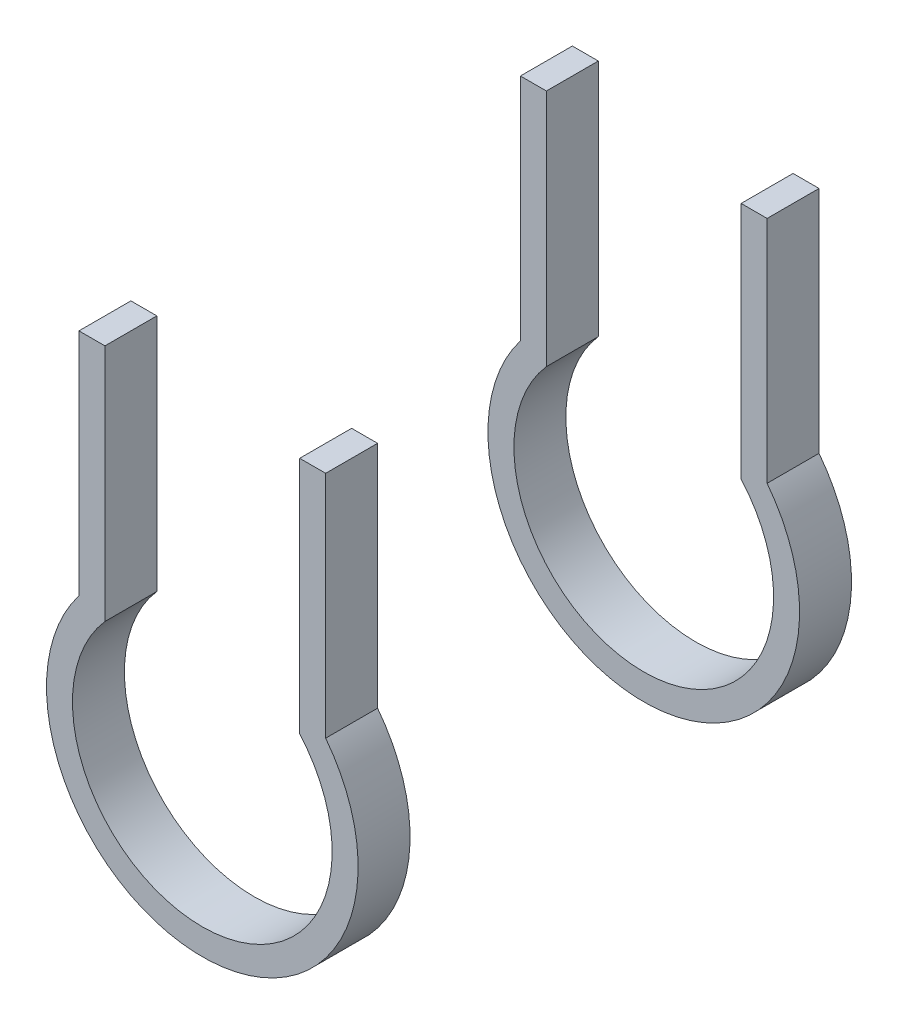
ISO-10303-21;
HEADER;
FILE_DESCRIPTION(('STEP AP214'),'2;1');
FILE_NAME('part.step','',(''),(''),'','','');
FILE_SCHEMA(('AUTOMOTIVE_DESIGN { 1 0 10303 214 1 1 1 1 }'));
ENDSEC;
DATA;
#1=APPLICATION_CONTEXT('core data for automotive mechanical design processes');
#2=APPLICATION_PROTOCOL_DEFINITION('international standard','automotive_design',2000,#1);
#3=PRODUCT_CONTEXT('',#1,'mechanical');
#4=PRODUCT('Part','Part','',(#3));
#5=PRODUCT_RELATED_PRODUCT_CATEGORY('part','',(#4));
#6=PRODUCT_DEFINITION_FORMATION('','',#4);
#7=PRODUCT_DEFINITION_CONTEXT('part definition',#1,'design');
#8=PRODUCT_DEFINITION('design','',#6,#7);
#9=PRODUCT_DEFINITION_SHAPE('','',#8);
#10=(LENGTH_UNIT() NAMED_UNIT(*) SI_UNIT(.MILLI.,.METRE.));
#11=(NAMED_UNIT(*) PLANE_ANGLE_UNIT() SI_UNIT($,.RADIAN.));
#12=(NAMED_UNIT(*) SI_UNIT($,.STERADIAN.) SOLID_ANGLE_UNIT());
#13=UNCERTAINTY_MEASURE_WITH_UNIT(LENGTH_MEASURE(1.E-05),#10,'distance_accuracy_value','');
#14=(GEOMETRIC_REPRESENTATION_CONTEXT(3) GLOBAL_UNCERTAINTY_ASSIGNED_CONTEXT((#13)) GLOBAL_UNIT_ASSIGNED_CONTEXT((#10,
#11,#12)) REPRESENTATION_CONTEXT('',''));
#15=CARTESIAN_POINT('',(0.,0.,0.));
#16=DIRECTION('',(0.,0.,1.));
#17=DIRECTION('',(1.,0.,0.));
#18=AXIS2_PLACEMENT_3D('',#15,#16,#17);
#19=CARTESIAN_POINT('',(-19.,50.,76.));
#20=DIRECTION('',(0.,-1.,0.));
#21=DIRECTION('',(0.,0.,-1.));
#22=AXIS2_PLACEMENT_3D('',#19,#20,#21);
#23=PLANE('',#22);
#24=DIRECTION('',(1.,0.,0.));
#25=VECTOR('',#24,1.);
#26=CARTESIAN_POINT('',(-19.,50.,68.));
#27=LINE('',#26,#25);
#28=CARTESIAN_POINT('',(-19.,50.,68.));
#29=VERTEX_POINT('',#28);
#30=CARTESIAN_POINT('',(-15.,50.,68.));
#31=VERTEX_POINT('',#30);
#32=EDGE_CURVE('E84',#29,#31,#27,.T.);
#33=ORIENTED_EDGE('',*,*,#32,.F.);
#34=DIRECTION('',(0.,0.,-1.));
#35=VECTOR('',#34,1.);
#36=CARTESIAN_POINT('',(-19.,50.,76.));
#37=LINE('',#36,#35);
#38=CARTESIAN_POINT('',(-19.,50.,76.));
#39=VERTEX_POINT('',#38);
#40=EDGE_CURVE('E113',#39,#29,#37,.T.);
#41=ORIENTED_EDGE('',*,*,#40,.F.);
#42=DIRECTION('',(-1.,0.,0.));
#43=VECTOR('',#42,1.);
#44=CARTESIAN_POINT('',(-19.,50.,76.));
#45=LINE('',#44,#43);
#46=CARTESIAN_POINT('',(-15.,50.,76.));
#47=VERTEX_POINT('',#46);
#48=EDGE_CURVE('E118',#47,#39,#45,.T.);
#49=ORIENTED_EDGE('',*,*,#48,.F.);
#50=DIRECTION('',(0.,0.,-1.));
#51=VECTOR('',#50,1.);
#52=CARTESIAN_POINT('',(-15.,50.,76.));
#53=LINE('',#52,#51);
#54=EDGE_CURVE('E45',#47,#31,#53,.T.);
#55=ORIENTED_EDGE('',*,*,#54,.T.);
#56=EDGE_LOOP('',(#33,#41,#49,#55));
#57=FACE_BOUND('',#56,.T.);
#58=ADVANCED_FACE('F42',(#57),#23,.F.);
#59=CARTESIAN_POINT('',(-19.,50.,76.));
#60=DIRECTION('',(1.,0.,0.));
#61=DIRECTION('',(0.,1.,0.));
#62=AXIS2_PLACEMENT_3D('',#59,#60,#61);
#63=PLANE('',#62);
#64=DIRECTION('',(0.,1.,0.));
#65=VECTOR('',#64,1.);
#66=CARTESIAN_POINT('',(-19.,50.,68.));
#67=LINE('',#66,#65);
#68=CARTESIAN_POINT('',(-19.,14.6628782986152,68.));
#69=VERTEX_POINT('',#68);
#70=EDGE_CURVE('E12',#69,#29,#67,.T.);
#71=ORIENTED_EDGE('',*,*,#70,.F.);
#72=DIRECTION('',(0.,0.,-1.));
#73=VECTOR('',#72,1.);
#74=CARTESIAN_POINT('',(-19.,14.6628782986152,76.));
#75=LINE('',#74,#73);
#76=CARTESIAN_POINT('',(-19.,14.6628782986152,76.));
#77=VERTEX_POINT('',#76);
#78=EDGE_CURVE('E115',#77,#69,#75,.T.);
#79=ORIENTED_EDGE('',*,*,#78,.F.);
#80=DIRECTION('',(0.,-1.,0.));
#81=VECTOR('',#80,1.);
#82=CARTESIAN_POINT('',(-19.,50.,76.));
#83=LINE('',#82,#81);
#84=EDGE_CURVE('E107',#39,#77,#83,.T.);
#85=ORIENTED_EDGE('',*,*,#84,.F.);
#86=ORIENTED_EDGE('',*,*,#40,.T.);
#87=EDGE_LOOP('',(#71,#79,#85,#86));
#88=FACE_BOUND('',#87,.T.);
#89=ADVANCED_FACE('F111',(#88),#63,.F.);
#90=CARTESIAN_POINT('',(0.,0.,76.));
#91=DIRECTION('',(0.,0.,-1.));
#92=DIRECTION('',(-1.,0.,0.));
#93=AXIS2_PLACEMENT_3D('',#90,#91,#92);
#94=CYLINDRICAL_SURFACE('',#93,24.);
#95=CARTESIAN_POINT('',(0.,0.,68.));
#96=DIRECTION('',(0.,0.,-1.));
#97=DIRECTION('',(-1.,0.,0.));
#98=AXIS2_PLACEMENT_3D('',#95,#96,#97);
#99=CIRCLE('',#98,24.);
#100=CARTESIAN_POINT('',(19.,14.6628782986152,68.));
#101=VERTEX_POINT('',#100);
#102=EDGE_CURVE('E51',#101,#69,#99,.T.);
#103=ORIENTED_EDGE('',*,*,#102,.F.);
#104=DIRECTION('',(0.,0.,-1.));
#105=VECTOR('',#104,1.);
#106=CARTESIAN_POINT('',(19.,14.6628782986152,76.));
#107=LINE('',#106,#105);
#108=CARTESIAN_POINT('',(19.,14.6628782986152,76.));
#109=VERTEX_POINT('',#108);
#110=EDGE_CURVE('E130',#109,#101,#107,.T.);
#111=ORIENTED_EDGE('',*,*,#110,.F.);
#112=CARTESIAN_POINT('',(0.,0.,76.));
#113=DIRECTION('',(0.,0.,1.));
#114=DIRECTION('',(1.,0.,0.));
#115=AXIS2_PLACEMENT_3D('',#112,#113,#114);
#116=CIRCLE('',#115,24.);
#117=EDGE_CURVE('E117',#77,#109,#116,.T.);
#118=ORIENTED_EDGE('',*,*,#117,.F.);
#119=ORIENTED_EDGE('',*,*,#78,.T.);
#120=EDGE_LOOP('',(#103,#111,#118,#119));
#121=FACE_BOUND('',#120,.T.);
#122=ADVANCED_FACE('F186',(#121),#94,.T.);
#123=CARTESIAN_POINT('',(19.,50.,76.));
#124=DIRECTION('',(-1.,0.,0.));
#125=DIRECTION('',(0.,-1.,0.));
#126=AXIS2_PLACEMENT_3D('',#123,#124,#125);
#127=PLANE('',#126);
#128=DIRECTION('',(0.,-1.,0.));
#129=VECTOR('',#128,1.);
#130=CARTESIAN_POINT('',(19.,50.,68.));
#131=LINE('',#130,#129);
#132=CARTESIAN_POINT('',(19.,50.,68.));
#133=VERTEX_POINT('',#132);
#134=EDGE_CURVE('E169',#133,#101,#131,.T.);
#135=ORIENTED_EDGE('',*,*,#134,.F.);
#136=DIRECTION('',(0.,0.,-1.));
#137=VECTOR('',#136,1.);
#138=CARTESIAN_POINT('',(19.,50.,76.));
#139=LINE('',#138,#137);
#140=CARTESIAN_POINT('',(19.,50.,76.));
#141=VERTEX_POINT('',#140);
#142=EDGE_CURVE('E137',#141,#133,#139,.T.);
#143=ORIENTED_EDGE('',*,*,#142,.F.);
#144=DIRECTION('',(0.,1.,0.));
#145=VECTOR('',#144,1.);
#146=CARTESIAN_POINT('',(19.,50.,76.));
#147=LINE('',#146,#145);
#148=EDGE_CURVE('E165',#109,#141,#147,.T.);
#149=ORIENTED_EDGE('',*,*,#148,.F.);
#150=ORIENTED_EDGE('',*,*,#110,.T.);
#151=EDGE_LOOP('',(#135,#143,#149,#150));
#152=FACE_BOUND('',#151,.T.);
#153=ADVANCED_FACE('F179',(#152),#127,.F.);
#154=CARTESIAN_POINT('',(15.,50.,76.));
#155=DIRECTION('',(0.,-1.,0.));
#156=DIRECTION('',(0.,0.,-1.));
#157=AXIS2_PLACEMENT_3D('',#154,#155,#156);
#158=PLANE('',#157);
#159=DIRECTION('',(1.,0.,0.));
#160=VECTOR('',#159,1.);
#161=CARTESIAN_POINT('',(15.,50.,68.));
#162=LINE('',#161,#160);
#163=CARTESIAN_POINT('',(15.,50.,68.));
#164=VERTEX_POINT('',#163);
#165=EDGE_CURVE('E155',#164,#133,#162,.T.);
#166=ORIENTED_EDGE('',*,*,#165,.F.);
#167=DIRECTION('',(0.,0.,-1.));
#168=VECTOR('',#167,1.);
#169=CARTESIAN_POINT('',(15.,50.,76.));
#170=LINE('',#169,#168);
#171=CARTESIAN_POINT('',(15.,50.,76.));
#172=VERTEX_POINT('',#171);
#173=EDGE_CURVE('E140',#172,#164,#170,.T.);
#174=ORIENTED_EDGE('',*,*,#173,.F.);
#175=DIRECTION('',(-1.,0.,0.));
#176=VECTOR('',#175,1.);
#177=CARTESIAN_POINT('',(15.,50.,76.));
#178=LINE('',#177,#176);
#179=EDGE_CURVE('E163',#141,#172,#178,.T.);
#180=ORIENTED_EDGE('',*,*,#179,.F.);
#181=ORIENTED_EDGE('',*,*,#142,.T.);
#182=EDGE_LOOP('',(#166,#174,#180,#181));
#183=FACE_BOUND('',#182,.T.);
#184=ADVANCED_FACE('F183',(#183),#158,.F.);
#185=CARTESIAN_POINT('',(15.,50.,76.));
#186=DIRECTION('',(1.,0.,0.));
#187=DIRECTION('',(0.,1.,0.));
#188=AXIS2_PLACEMENT_3D('',#185,#186,#187);
#189=PLANE('',#188);
#190=DIRECTION('',(0.,1.,0.));
#191=VECTOR('',#190,1.);
#192=CARTESIAN_POINT('',(15.,50.,68.));
#193=LINE('',#192,#191);
#194=CARTESIAN_POINT('',(15.,13.2287565553229,68.));
#195=VERTEX_POINT('',#194);
#196=EDGE_CURVE('E154',#195,#164,#193,.T.);
#197=ORIENTED_EDGE('',*,*,#196,.F.);
#198=DIRECTION('',(0.,0.,-1.));
#199=VECTOR('',#198,1.);
#200=CARTESIAN_POINT('',(15.,13.2287565553229,76.));
#201=LINE('',#200,#199);
#202=CARTESIAN_POINT('',(15.,13.2287565553229,76.));
#203=VERTEX_POINT('',#202);
#204=EDGE_CURVE('E143',#203,#195,#201,.T.);
#205=ORIENTED_EDGE('',*,*,#204,.F.);
#206=DIRECTION('',(0.,-1.,0.));
#207=VECTOR('',#206,1.);
#208=CARTESIAN_POINT('',(15.,50.,76.));
#209=LINE('',#208,#207);
#210=EDGE_CURVE('E161',#172,#203,#209,.T.);
#211=ORIENTED_EDGE('',*,*,#210,.F.);
#212=ORIENTED_EDGE('',*,*,#173,.T.);
#213=EDGE_LOOP('',(#197,#205,#211,#212));
#214=FACE_BOUND('',#213,.T.);
#215=ADVANCED_FACE('F220',(#214),#189,.F.);
#216=CARTESIAN_POINT('',(0.,0.,76.));
#217=DIRECTION('',(0.,0.,-1.));
#218=DIRECTION('',(-1.,0.,0.));
#219=AXIS2_PLACEMENT_3D('',#216,#217,#218);
#220=CYLINDRICAL_SURFACE('',#219,20.);
#221=CARTESIAN_POINT('',(0.,0.,68.));
#222=DIRECTION('',(0.,0.,-1.));
#223=DIRECTION('',(-1.,0.,0.));
#224=AXIS2_PLACEMENT_3D('',#221,#222,#223);
#225=CIRCLE('',#224,20.);
#226=CARTESIAN_POINT('',(-15.,13.228756555323,68.));
#227=VERTEX_POINT('',#226);
#228=EDGE_CURVE('E77',#227,#195,#225,.F.);
#229=ORIENTED_EDGE('',*,*,#228,.F.);
#230=DIRECTION('',(0.,0.,-1.));
#231=VECTOR('',#230,1.);
#232=CARTESIAN_POINT('',(-15.,13.228756555323,76.));
#233=LINE('',#232,#231);
#234=CARTESIAN_POINT('',(-15.,13.228756555323,76.));
#235=VERTEX_POINT('',#234);
#236=EDGE_CURVE('E127',#235,#227,#233,.T.);
#237=ORIENTED_EDGE('',*,*,#236,.F.);
#238=CARTESIAN_POINT('',(0.,0.,76.));
#239=DIRECTION('',(0.,0.,-1.));
#240=DIRECTION('',(1.,0.,0.));
#241=AXIS2_PLACEMENT_3D('',#238,#239,#240);
#242=CIRCLE('',#241,20.);
#243=EDGE_CURVE('E152',#203,#235,#242,.T.);
#244=ORIENTED_EDGE('',*,*,#243,.F.);
#245=ORIENTED_EDGE('',*,*,#204,.T.);
#246=EDGE_LOOP('',(#229,#237,#244,#245));
#247=FACE_BOUND('',#246,.T.);
#248=ADVANCED_FACE('F151',(#247),#220,.F.);
#249=CARTESIAN_POINT('',(-15.,50.,76.));
#250=DIRECTION('',(-1.,0.,0.));
#251=DIRECTION('',(0.,-1.,0.));
#252=AXIS2_PLACEMENT_3D('',#249,#250,#251);
#253=PLANE('',#252);
#254=DIRECTION('',(0.,-1.,0.));
#255=VECTOR('',#254,1.);
#256=CARTESIAN_POINT('',(-15.,50.,68.));
#257=LINE('',#256,#255);
#258=EDGE_CURVE('E81',#31,#227,#257,.T.);
#259=ORIENTED_EDGE('',*,*,#258,.F.);
#260=ORIENTED_EDGE('',*,*,#54,.F.);
#261=DIRECTION('',(0.,1.,0.));
#262=VECTOR('',#261,1.);
#263=CARTESIAN_POINT('',(-15.,50.,76.));
#264=LINE('',#263,#262);
#265=EDGE_CURVE('E123',#235,#47,#264,.T.);
#266=ORIENTED_EDGE('',*,*,#265,.F.);
#267=ORIENTED_EDGE('',*,*,#236,.T.);
#268=EDGE_LOOP('',(#259,#260,#266,#267));
#269=FACE_BOUND('',#268,.T.);
#270=ADVANCED_FACE('F148',(#269),#253,.F.);
#271=CARTESIAN_POINT('',(0.,0.,76.));
#272=DIRECTION('',(0.,0.,1.));
#273=DIRECTION('',(1.,0.,0.));
#274=AXIS2_PLACEMENT_3D('',#271,#272,#273);
#275=PLANE('',#274);
#276=ORIENTED_EDGE('',*,*,#48,.T.);
#277=ORIENTED_EDGE('',*,*,#84,.T.);
#278=ORIENTED_EDGE('',*,*,#117,.T.);
#279=ORIENTED_EDGE('',*,*,#148,.T.);
#280=ORIENTED_EDGE('',*,*,#179,.T.);
#281=ORIENTED_EDGE('',*,*,#210,.T.);
#282=ORIENTED_EDGE('',*,*,#243,.T.);
#283=ORIENTED_EDGE('',*,*,#265,.T.);
#284=EDGE_LOOP('',(#276,#277,#278,#279,#280,#281,#282,#283));
#285=FACE_BOUND('',#284,.T.);
#286=ADVANCED_FACE('F121',(#285),#275,.T.);
#287=CARTESIAN_POINT('',(0.,0.,68.));
#288=DIRECTION('',(0.,0.,-1.));
#289=DIRECTION('',(-1.,0.,0.));
#290=AXIS2_PLACEMENT_3D('',#287,#288,#289);
#291=PLANE('',#290);
#292=ORIENTED_EDGE('',*,*,#32,.T.);
#293=ORIENTED_EDGE('',*,*,#258,.T.);
#294=ORIENTED_EDGE('',*,*,#228,.T.);
#295=ORIENTED_EDGE('',*,*,#196,.T.);
#296=ORIENTED_EDGE('',*,*,#165,.T.);
#297=ORIENTED_EDGE('',*,*,#134,.T.);
#298=ORIENTED_EDGE('',*,*,#102,.T.);
#299=ORIENTED_EDGE('',*,*,#70,.T.);
#300=EDGE_LOOP('',(#292,#293,#294,#295,#296,#297,#298,#299));
#301=FACE_BOUND('',#300,.T.);
#302=ADVANCED_FACE('F173',(#301),#291,.T.);
#303=CLOSED_SHELL('',(#58,#89,#122,#153,#184,#215,#248,#270,#286,#302));
#304=MANIFOLD_SOLID_BREP('B2',#303);
#305=CARTESIAN_POINT('',(0.,0.,0.));
#306=DIRECTION('',(0.,0.,1.));
#307=DIRECTION('',(1.,0.,0.));
#308=AXIS2_PLACEMENT_3D('',#305,#306,#307);
#309=PLANE('',#308);
#310=DIRECTION('',(-1.,0.,0.));
#311=VECTOR('',#310,1.);
#312=CARTESIAN_POINT('',(-19.,50.,0.));
#313=LINE('',#312,#311);
#314=CARTESIAN_POINT('',(-15.,50.,0.));
#315=VERTEX_POINT('',#314);
#316=CARTESIAN_POINT('',(-19.,50.,0.));
#317=VERTEX_POINT('',#316);
#318=EDGE_CURVE('E338',#315,#317,#313,.T.);
#319=ORIENTED_EDGE('',*,*,#318,.F.);
#320=DIRECTION('',(0.,1.,0.));
#321=VECTOR('',#320,1.);
#322=CARTESIAN_POINT('',(-15.,50.,0.));
#323=LINE('',#322,#321);
#324=CARTESIAN_POINT('',(-15.,13.228756555323,0.));
#325=VERTEX_POINT('',#324);
#326=EDGE_CURVE('E343',#325,#315,#323,.T.);
#327=ORIENTED_EDGE('',*,*,#326,.F.);
#328=CARTESIAN_POINT('',(0.,0.,0.));
#329=DIRECTION('',(0.,0.,-1.));
#330=DIRECTION('',(1.,0.,0.));
#331=AXIS2_PLACEMENT_3D('',#328,#329,#330);
#332=CIRCLE('',#331,20.);
#333=CARTESIAN_POINT('',(15.,13.2287565553229,0.));
#334=VERTEX_POINT('',#333);
#335=EDGE_CURVE('E349',#334,#325,#332,.T.);
#336=ORIENTED_EDGE('',*,*,#335,.F.);
#337=DIRECTION('',(0.,-1.,0.));
#338=VECTOR('',#337,1.);
#339=CARTESIAN_POINT('',(15.,50.,0.));
#340=LINE('',#339,#338);
#341=CARTESIAN_POINT('',(15.,50.,0.));
#342=VERTEX_POINT('',#341);
#343=EDGE_CURVE('E383',#342,#334,#340,.T.);
#344=ORIENTED_EDGE('',*,*,#343,.F.);
#345=DIRECTION('',(-1.,0.,0.));
#346=VECTOR('',#345,1.);
#347=CARTESIAN_POINT('',(15.,50.,0.));
#348=LINE('',#347,#346);
#349=CARTESIAN_POINT('',(19.,50.,0.));
#350=VERTEX_POINT('',#349);
#351=EDGE_CURVE('E380',#350,#342,#348,.T.);
#352=ORIENTED_EDGE('',*,*,#351,.F.);
#353=DIRECTION('',(0.,1.,0.));
#354=VECTOR('',#353,1.);
#355=CARTESIAN_POINT('',(19.,50.,0.));
#356=LINE('',#355,#354);
#357=CARTESIAN_POINT('',(19.,14.6628782986152,0.));
#358=VERTEX_POINT('',#357);
#359=EDGE_CURVE('E377',#358,#350,#356,.T.);
#360=ORIENTED_EDGE('',*,*,#359,.F.);
#361=CARTESIAN_POINT('',(0.,0.,0.));
#362=DIRECTION('',(0.,0.,1.));
#363=DIRECTION('',(1.,0.,0.));
#364=AXIS2_PLACEMENT_3D('',#361,#362,#363);
#365=CIRCLE('',#364,24.);
#366=CARTESIAN_POINT('',(-19.,14.6628782986152,0.));
#367=VERTEX_POINT('',#366);
#368=EDGE_CURVE('E371',#367,#358,#365,.T.);
#369=ORIENTED_EDGE('',*,*,#368,.F.);
#370=DIRECTION('',(0.,-1.,0.));
#371=VECTOR('',#370,1.);
#372=CARTESIAN_POINT('',(-19.,50.,0.));
#373=LINE('',#372,#371);
#374=EDGE_CURVE('E366',#317,#367,#373,.T.);
#375=ORIENTED_EDGE('',*,*,#374,.F.);
#376=EDGE_LOOP('',(#319,#327,#336,#344,#352,#360,#369,#375));
#377=FACE_BOUND('',#376,.T.);
#378=ADVANCED_FACE('F269',(#377),#309,.F.);
#379=CARTESIAN_POINT('',(-15.,50.,76.));
#380=DIRECTION('',(-1.,0.,0.));
#381=DIRECTION('',(0.,-1.,0.));
#382=AXIS2_PLACEMENT_3D('',#379,#380,#381);
#383=PLANE('',#382);
#384=DIRECTION('',(0.,0.,-1.));
#385=VECTOR('',#384,1.);
#386=CARTESIAN_POINT('',(-15.,50.,76.));
#387=LINE('',#386,#385);
#388=CARTESIAN_POINT('',(-15.,50.,7.99999999999999));
#389=VERTEX_POINT('',#388);
#390=EDGE_CURVE('E291',#389,#315,#387,.T.);
#391=ORIENTED_EDGE('',*,*,#390,.F.);
#392=DIRECTION('',(0.,-1.,0.));
#393=VECTOR('',#392,1.);
#394=CARTESIAN_POINT('',(-15.,50.,7.99999999999999));
#395=LINE('',#394,#393);
#396=CARTESIAN_POINT('',(-15.,13.228756555323,7.99999999999999));
#397=VERTEX_POINT('',#396);
#398=EDGE_CURVE('E40',#389,#397,#395,.T.);
#399=ORIENTED_EDGE('',*,*,#398,.T.);
#400=DIRECTION('',(0.,0.,-1.));
#401=VECTOR('',#400,1.);
#402=CARTESIAN_POINT('',(-15.,13.228756555323,76.));
#403=LINE('',#402,#401);
#404=EDGE_CURVE('E345',#397,#325,#403,.T.);
#405=ORIENTED_EDGE('',*,*,#404,.T.);
#406=ORIENTED_EDGE('',*,*,#326,.T.);
#407=EDGE_LOOP('',(#391,#399,#405,#406));
#408=FACE_BOUND('',#407,.T.);
#409=ADVANCED_FACE('F341',(#408),#383,.F.);
#410=CARTESIAN_POINT('',(0.,0.,76.));
#411=DIRECTION('',(0.,0.,-1.));
#412=DIRECTION('',(-1.,0.,0.));
#413=AXIS2_PLACEMENT_3D('',#410,#411,#412);
#414=CYLINDRICAL_SURFACE('',#413,20.);
#415=ORIENTED_EDGE('',*,*,#404,.F.);
#416=CARTESIAN_POINT('',(0.,0.,7.99999999999999));
#417=DIRECTION('',(0.,0.,-1.));
#418=DIRECTION('',(-1.,0.,0.));
#419=AXIS2_PLACEMENT_3D('',#416,#417,#418);
#420=CIRCLE('',#419,20.);
#421=CARTESIAN_POINT('',(15.,13.2287565553229,7.99999999999999));
#422=VERTEX_POINT('',#421);
#423=EDGE_CURVE('E284',#397,#422,#420,.F.);
#424=ORIENTED_EDGE('',*,*,#423,.T.);
#425=DIRECTION('',(0.,0.,-1.));
#426=VECTOR('',#425,1.);
#427=CARTESIAN_POINT('',(15.,13.2287565553229,76.));
#428=LINE('',#427,#426);
#429=EDGE_CURVE('E347',#422,#334,#428,.T.);
#430=ORIENTED_EDGE('',*,*,#429,.T.);
#431=ORIENTED_EDGE('',*,*,#335,.T.);
#432=EDGE_LOOP('',(#415,#424,#430,#431));
#433=FACE_BOUND('',#432,.T.);
#434=ADVANCED_FACE('F388',(#433),#414,.F.);
#435=CARTESIAN_POINT('',(15.,50.,76.));
#436=DIRECTION('',(1.,0.,0.));
#437=DIRECTION('',(0.,1.,0.));
#438=AXIS2_PLACEMENT_3D('',#435,#436,#437);
#439=PLANE('',#438);
#440=ORIENTED_EDGE('',*,*,#429,.F.);
#441=DIRECTION('',(0.,1.,0.));
#442=VECTOR('',#441,1.);
#443=CARTESIAN_POINT('',(15.,50.,7.99999999999999));
#444=LINE('',#443,#442);
#445=CARTESIAN_POINT('',(15.,50.,7.99999999999999));
#446=VERTEX_POINT('',#445);
#447=EDGE_CURVE('E396',#422,#446,#444,.T.);
#448=ORIENTED_EDGE('',*,*,#447,.T.);
#449=DIRECTION('',(0.,0.,-1.));
#450=VECTOR('',#449,1.);
#451=CARTESIAN_POINT('',(15.,50.,76.));
#452=LINE('',#451,#450);
#453=EDGE_CURVE('E354',#446,#342,#452,.T.);
#454=ORIENTED_EDGE('',*,*,#453,.T.);
#455=ORIENTED_EDGE('',*,*,#343,.T.);
#456=EDGE_LOOP('',(#440,#448,#454,#455));
#457=FACE_BOUND('',#456,.T.);
#458=ADVANCED_FACE('F393',(#457),#439,.F.);
#459=CARTESIAN_POINT('',(15.,50.,76.));
#460=DIRECTION('',(0.,-1.,0.));
#461=DIRECTION('',(0.,0.,-1.));
#462=AXIS2_PLACEMENT_3D('',#459,#460,#461);
#463=PLANE('',#462);
#464=ORIENTED_EDGE('',*,*,#453,.F.);
#465=DIRECTION('',(1.,0.,0.));
#466=VECTOR('',#465,1.);
#467=CARTESIAN_POINT('',(15.,50.,7.99999999999999));
#468=LINE('',#467,#466);
#469=CARTESIAN_POINT('',(19.,50.,7.99999999999999));
#470=VERTEX_POINT('',#469);
#471=EDGE_CURVE('E401',#446,#470,#468,.T.);
#472=ORIENTED_EDGE('',*,*,#471,.T.);
#473=DIRECTION('',(0.,0.,-1.));
#474=VECTOR('',#473,1.);
#475=CARTESIAN_POINT('',(19.,50.,76.));
#476=LINE('',#475,#474);
#477=EDGE_CURVE('E356',#470,#350,#476,.T.);
#478=ORIENTED_EDGE('',*,*,#477,.T.);
#479=ORIENTED_EDGE('',*,*,#351,.T.);
#480=EDGE_LOOP('',(#464,#472,#478,#479));
#481=FACE_BOUND('',#480,.T.);
#482=ADVANCED_FACE('F399',(#481),#463,.F.);
#483=CARTESIAN_POINT('',(19.,50.,76.));
#484=DIRECTION('',(-1.,0.,0.));
#485=DIRECTION('',(0.,-1.,0.));
#486=AXIS2_PLACEMENT_3D('',#483,#484,#485);
#487=PLANE('',#486);
#488=ORIENTED_EDGE('',*,*,#477,.F.);
#489=DIRECTION('',(0.,-1.,0.));
#490=VECTOR('',#489,1.);
#491=CARTESIAN_POINT('',(19.,50.,7.99999999999999));
#492=LINE('',#491,#490);
#493=CARTESIAN_POINT('',(19.,14.6628782986152,7.99999999999999));
#494=VERTEX_POINT('',#493);
#495=EDGE_CURVE('E406',#470,#494,#492,.T.);
#496=ORIENTED_EDGE('',*,*,#495,.T.);
#497=DIRECTION('',(0.,0.,-1.));
#498=VECTOR('',#497,1.);
#499=CARTESIAN_POINT('',(19.,14.6628782986152,76.));
#500=LINE('',#499,#498);
#501=EDGE_CURVE('E358',#494,#358,#500,.T.);
#502=ORIENTED_EDGE('',*,*,#501,.T.);
#503=ORIENTED_EDGE('',*,*,#359,.T.);
#504=EDGE_LOOP('',(#488,#496,#502,#503));
#505=FACE_BOUND('',#504,.T.);
#506=ADVANCED_FACE('F404',(#505),#487,.F.);
#507=CARTESIAN_POINT('',(0.,0.,76.));
#508=DIRECTION('',(0.,0.,-1.));
#509=DIRECTION('',(-1.,0.,0.));
#510=AXIS2_PLACEMENT_3D('',#507,#508,#509);
#511=CYLINDRICAL_SURFACE('',#510,24.);
#512=ORIENTED_EDGE('',*,*,#501,.F.);
#513=CARTESIAN_POINT('',(0.,0.,7.99999999999999));
#514=DIRECTION('',(0.,0.,-1.));
#515=DIRECTION('',(-1.,0.,0.));
#516=AXIS2_PLACEMENT_3D('',#513,#514,#515);
#517=CIRCLE('',#516,24.);
#518=CARTESIAN_POINT('',(-19.,14.6628782986152,7.99999999999999));
#519=VERTEX_POINT('',#518);
#520=EDGE_CURVE('E410',#494,#519,#517,.T.);
#521=ORIENTED_EDGE('',*,*,#520,.T.);
#522=DIRECTION('',(0.,0.,-1.));
#523=VECTOR('',#522,1.);
#524=CARTESIAN_POINT('',(-19.,14.6628782986152,76.));
#525=LINE('',#524,#523);
#526=EDGE_CURVE('E360',#519,#367,#525,.T.);
#527=ORIENTED_EDGE('',*,*,#526,.T.);
#528=ORIENTED_EDGE('',*,*,#368,.T.);
#529=EDGE_LOOP('',(#512,#521,#527,#528));
#530=FACE_BOUND('',#529,.T.);
#531=ADVANCED_FACE('F409',(#530),#511,.T.);
#532=CARTESIAN_POINT('',(-19.,50.,76.));
#533=DIRECTION('',(1.,0.,0.));
#534=DIRECTION('',(0.,1.,0.));
#535=AXIS2_PLACEMENT_3D('',#532,#533,#534);
#536=PLANE('',#535);
#537=ORIENTED_EDGE('',*,*,#526,.F.);
#538=DIRECTION('',(0.,1.,0.));
#539=VECTOR('',#538,1.);
#540=CARTESIAN_POINT('',(-19.,50.,7.99999999999999));
#541=LINE('',#540,#539);
#542=CARTESIAN_POINT('',(-19.,50.,7.99999999999999));
#543=VERTEX_POINT('',#542);
#544=EDGE_CURVE('E339',#519,#543,#541,.T.);
#545=ORIENTED_EDGE('',*,*,#544,.T.);
#546=DIRECTION('',(0.,0.,-1.));
#547=VECTOR('',#546,1.);
#548=CARTESIAN_POINT('',(-19.,50.,76.));
#549=LINE('',#548,#547);
#550=EDGE_CURVE('E277',#543,#317,#549,.T.);
#551=ORIENTED_EDGE('',*,*,#550,.T.);
#552=ORIENTED_EDGE('',*,*,#374,.T.);
#553=EDGE_LOOP('',(#537,#545,#551,#552));
#554=FACE_BOUND('',#553,.T.);
#555=ADVANCED_FACE('F365',(#554),#536,.F.);
#556=CARTESIAN_POINT('',(-19.,50.,76.));
#557=DIRECTION('',(0.,-1.,0.));
#558=DIRECTION('',(0.,0.,-1.));
#559=AXIS2_PLACEMENT_3D('',#556,#557,#558);
#560=PLANE('',#559);
#561=ORIENTED_EDGE('',*,*,#550,.F.);
#562=DIRECTION('',(1.,0.,0.));
#563=VECTOR('',#562,1.);
#564=CARTESIAN_POINT('',(-19.,50.,7.99999999999999));
#565=LINE('',#564,#563);
#566=EDGE_CURVE('E333',#543,#389,#565,.T.);
#567=ORIENTED_EDGE('',*,*,#566,.T.);
#568=ORIENTED_EDGE('',*,*,#390,.T.);
#569=ORIENTED_EDGE('',*,*,#318,.T.);
#570=EDGE_LOOP('',(#561,#567,#568,#569));
#571=FACE_BOUND('',#570,.T.);
#572=ADVANCED_FACE('F271',(#571),#560,.F.);
#573=CARTESIAN_POINT('',(0.,0.,8.));
#574=DIRECTION('',(0.,0.,-1.));
#575=DIRECTION('',(-1.,0.,0.));
#576=AXIS2_PLACEMENT_3D('',#573,#574,#575);
#577=PLANE('',#576);
#578=ORIENTED_EDGE('',*,*,#544,.F.);
#579=ORIENTED_EDGE('',*,*,#520,.F.);
#580=ORIENTED_EDGE('',*,*,#495,.F.);
#581=ORIENTED_EDGE('',*,*,#471,.F.);
#582=ORIENTED_EDGE('',*,*,#447,.F.);
#583=ORIENTED_EDGE('',*,*,#423,.F.);
#584=ORIENTED_EDGE('',*,*,#398,.F.);
#585=ORIENTED_EDGE('',*,*,#566,.F.);
#586=EDGE_LOOP('',(#578,#579,#580,#581,#582,#583,#584,#585));
#587=FACE_BOUND('',#586,.T.);
#588=ADVANCED_FACE('F332',(#587),#577,.F.);
#589=CLOSED_SHELL('',(#378,#409,#434,#458,#482,#506,#531,#555,#572,#588));
#590=MANIFOLD_SOLID_BREP('B6',#589);
#591=ADVANCED_BREP_SHAPE_REPRESENTATION('',(#18,#304,#590),#14);
#592=SHAPE_DEFINITION_REPRESENTATION(#9,#591);
ENDSEC;
END-ISO-10303-21;
